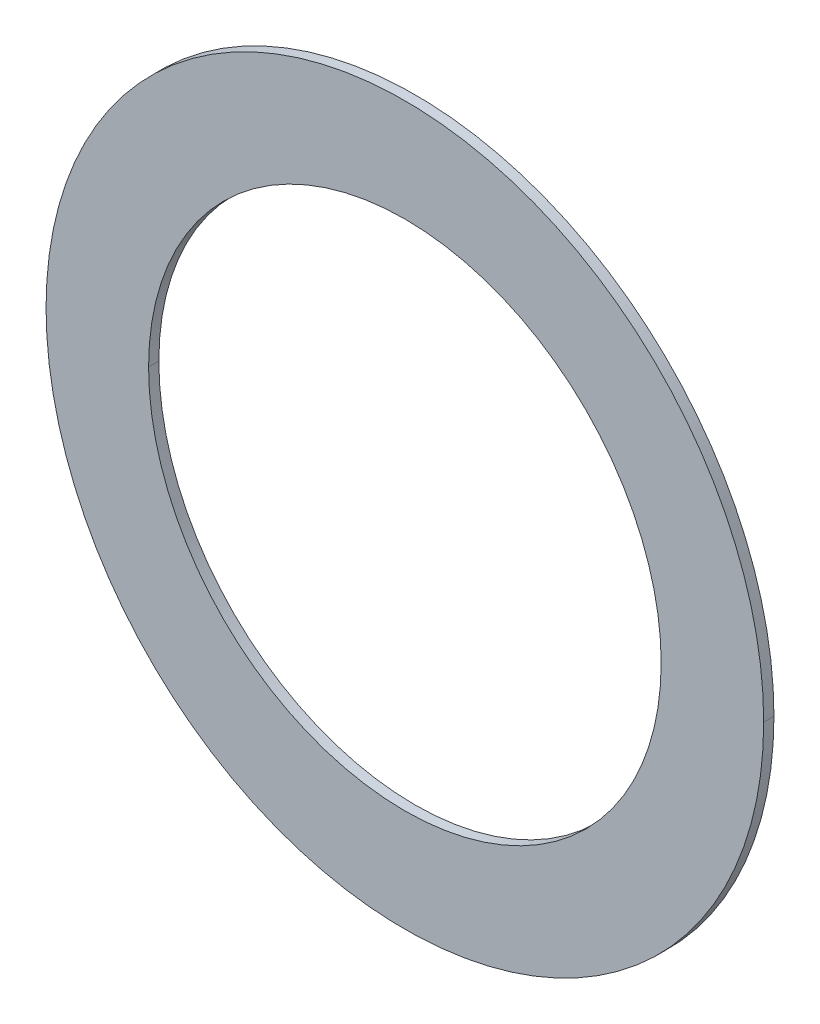
ISO-10303-21;
HEADER;
FILE_DESCRIPTION(('STEP AP214'),'2;1');
FILE_NAME('part.step','',(''),(''),'','','');
FILE_SCHEMA(('AUTOMOTIVE_DESIGN { 1 0 10303 214 1 1 1 1 }'));
ENDSEC;
DATA;
#1=APPLICATION_CONTEXT('core data for automotive mechanical design processes');
#2=APPLICATION_PROTOCOL_DEFINITION('international standard','automotive_design',2000,#1);
#3=PRODUCT_CONTEXT('',#1,'mechanical');
#4=PRODUCT('Part','Part','',(#3));
#5=PRODUCT_RELATED_PRODUCT_CATEGORY('part','',(#4));
#6=PRODUCT_DEFINITION_FORMATION('','',#4);
#7=PRODUCT_DEFINITION_CONTEXT('part definition',#1,'design');
#8=PRODUCT_DEFINITION('design','',#6,#7);
#9=PRODUCT_DEFINITION_SHAPE('','',#8);
#10=(LENGTH_UNIT() NAMED_UNIT(*) SI_UNIT(.MILLI.,.METRE.));
#11=(NAMED_UNIT(*) PLANE_ANGLE_UNIT() SI_UNIT($,.RADIAN.));
#12=(NAMED_UNIT(*) SI_UNIT($,.STERADIAN.) SOLID_ANGLE_UNIT());
#13=UNCERTAINTY_MEASURE_WITH_UNIT(LENGTH_MEASURE(1.E-05),#10,'distance_accuracy_value','');
#14=(GEOMETRIC_REPRESENTATION_CONTEXT(3) GLOBAL_UNCERTAINTY_ASSIGNED_CONTEXT((#13)) GLOBAL_UNIT_ASSIGNED_CONTEXT((#10,
#11,#12)) REPRESENTATION_CONTEXT('',''));
#15=CARTESIAN_POINT('',(0.,0.,0.));
#16=DIRECTION('',(0.,0.,1.));
#17=DIRECTION('',(1.,0.,0.));
#18=AXIS2_PLACEMENT_3D('',#15,#16,#17);
#19=CARTESIAN_POINT('',(0.,7.,0.));
#20=DIRECTION('',(0.,0.,1.));
#21=DIRECTION('',(1.,0.,0.));
#22=AXIS2_PLACEMENT_3D('',#19,#20,#21);
#23=PLANE('',#22);
#24=CARTESIAN_POINT('',(0.,0.,0.));
#25=DIRECTION('',(0.,0.,-1.));
#26=DIRECTION('',(-1.,0.,0.));
#27=AXIS2_PLACEMENT_3D('',#24,#25,#26);
#28=CIRCLE('',#27,5.);
#29=CARTESIAN_POINT('',(-5.,0.,0.));
#30=VERTEX_POINT('',#29);
#31=CARTESIAN_POINT('',(5.,0.,0.));
#32=VERTEX_POINT('',#31);
#33=EDGE_CURVE('E11',#30,#32,#28,.T.);
#34=ORIENTED_EDGE('',*,*,#33,.T.);
#35=CARTESIAN_POINT('',(0.,0.,0.));
#36=DIRECTION('',(0.,0.,-1.));
#37=DIRECTION('',(-1.,0.,0.));
#38=AXIS2_PLACEMENT_3D('',#35,#36,#37);
#39=CIRCLE('',#38,5.);
#40=EDGE_CURVE('E25',#32,#30,#39,.T.);
#41=ORIENTED_EDGE('',*,*,#40,.T.);
#42=EDGE_LOOP('',(#34,#41));
#43=FACE_BOUND('',#42,.T.);
#44=CARTESIAN_POINT('',(0.,0.,0.));
#45=DIRECTION('',(0.,0.,-1.));
#46=DIRECTION('',(-1.,0.,0.));
#47=AXIS2_PLACEMENT_3D('',#44,#45,#46);
#48=CIRCLE('',#47,7.);
#49=CARTESIAN_POINT('',(7.,0.,0.));
#50=VERTEX_POINT('',#49);
#51=CARTESIAN_POINT('',(-7.,0.,0.));
#52=VERTEX_POINT('',#51);
#53=EDGE_CURVE('E95',#50,#52,#48,.T.);
#54=ORIENTED_EDGE('',*,*,#53,.F.);
#55=CARTESIAN_POINT('',(0.,0.,0.));
#56=DIRECTION('',(0.,0.,-1.));
#57=DIRECTION('',(-1.,0.,0.));
#58=AXIS2_PLACEMENT_3D('',#55,#56,#57);
#59=CIRCLE('',#58,7.);
#60=EDGE_CURVE('E90',#52,#50,#59,.T.);
#61=ORIENTED_EDGE('',*,*,#60,.F.);
#62=EDGE_LOOP('',(#54,#61));
#63=FACE_BOUND('',#62,.T.);
#64=ADVANCED_FACE('F17',(#43,#63),#23,.T.);
#65=CARTESIAN_POINT('',(0.,0.,-0.2));
#66=DIRECTION('',(0.,0.,-1.));
#67=DIRECTION('',(0.,-1.,0.));
#68=AXIS2_PLACEMENT_3D('',#65,#66,#67);
#69=CYLINDRICAL_SURFACE('',#68,7.);
#70=DIRECTION('',(0.,0.,-1.));
#71=VECTOR('',#70,1.);
#72=CARTESIAN_POINT('',(7.,0.,0.));
#73=LINE('',#72,#71);
#74=CARTESIAN_POINT('',(7.,0.,-0.2));
#75=VERTEX_POINT('',#74);
#76=EDGE_CURVE('E86',#50,#75,#73,.T.);
#77=ORIENTED_EDGE('',*,*,#76,.T.);
#78=CARTESIAN_POINT('',(0.,0.,-0.2));
#79=DIRECTION('',(0.,0.,-1.));
#80=DIRECTION('',(-1.,0.,0.));
#81=AXIS2_PLACEMENT_3D('',#78,#79,#80);
#82=CIRCLE('',#81,7.);
#83=CARTESIAN_POINT('',(-7.,0.,-0.2));
#84=VERTEX_POINT('',#83);
#85=EDGE_CURVE('E81',#84,#75,#82,.T.);
#86=ORIENTED_EDGE('',*,*,#85,.F.);
#87=DIRECTION('',(0.,0.,-1.));
#88=VECTOR('',#87,1.);
#89=CARTESIAN_POINT('',(-7.,0.,0.));
#90=LINE('',#89,#88);
#91=EDGE_CURVE('E70',#52,#84,#90,.T.);
#92=ORIENTED_EDGE('',*,*,#91,.F.);
#93=ORIENTED_EDGE('',*,*,#60,.T.);
#94=EDGE_LOOP('',(#77,#86,#92,#93));
#95=FACE_BOUND('',#94,.T.);
#96=ADVANCED_FACE('F111',(#95),#69,.T.);
#97=CARTESIAN_POINT('',(0.,0.,-0.2));
#98=DIRECTION('',(0.,0.,-1.));
#99=DIRECTION('',(0.,1.,0.));
#100=AXIS2_PLACEMENT_3D('',#97,#98,#99);
#101=CYLINDRICAL_SURFACE('',#100,7.);
#102=ORIENTED_EDGE('',*,*,#76,.F.);
#103=ORIENTED_EDGE('',*,*,#53,.T.);
#104=ORIENTED_EDGE('',*,*,#91,.T.);
#105=CARTESIAN_POINT('',(0.,0.,-0.2));
#106=DIRECTION('',(0.,0.,-1.));
#107=DIRECTION('',(-1.,0.,0.));
#108=AXIS2_PLACEMENT_3D('',#105,#106,#107);
#109=CIRCLE('',#108,7.);
#110=EDGE_CURVE('E67',#75,#84,#109,.T.);
#111=ORIENTED_EDGE('',*,*,#110,.F.);
#112=EDGE_LOOP('',(#102,#103,#104,#111));
#113=FACE_BOUND('',#112,.T.);
#114=ADVANCED_FACE('F106',(#113),#101,.T.);
#115=CARTESIAN_POINT('',(0.,5.,-0.2));
#116=DIRECTION('',(0.,0.,-1.));
#117=DIRECTION('',(-1.,0.,0.));
#118=AXIS2_PLACEMENT_3D('',#115,#116,#117);
#119=PLANE('',#118);
#120=ORIENTED_EDGE('',*,*,#85,.T.);
#121=ORIENTED_EDGE('',*,*,#110,.T.);
#122=EDGE_LOOP('',(#120,#121));
#123=FACE_BOUND('',#122,.T.);
#124=CARTESIAN_POINT('',(0.,0.,-0.2));
#125=DIRECTION('',(0.,0.,-1.));
#126=DIRECTION('',(-1.,0.,0.));
#127=AXIS2_PLACEMENT_3D('',#124,#125,#126);
#128=CIRCLE('',#127,5.);
#129=CARTESIAN_POINT('',(5.,0.,-0.2));
#130=VERTEX_POINT('',#129);
#131=CARTESIAN_POINT('',(-5.,0.,-0.2));
#132=VERTEX_POINT('',#131);
#133=EDGE_CURVE('E55',#130,#132,#128,.T.);
#134=ORIENTED_EDGE('',*,*,#133,.F.);
#135=CARTESIAN_POINT('',(0.,0.,-0.2));
#136=DIRECTION('',(0.,0.,-1.));
#137=DIRECTION('',(-1.,0.,0.));
#138=AXIS2_PLACEMENT_3D('',#135,#136,#137);
#139=CIRCLE('',#138,5.);
#140=EDGE_CURVE('E51',#132,#130,#139,.T.);
#141=ORIENTED_EDGE('',*,*,#140,.F.);
#142=EDGE_LOOP('',(#134,#141));
#143=FACE_BOUND('',#142,.T.);
#144=ADVANCED_FACE('F53',(#123,#143),#119,.T.);
#145=CARTESIAN_POINT('',(0.,0.,-0.2));
#146=DIRECTION('',(0.,0.,-1.));
#147=DIRECTION('',(0.,-1.,0.));
#148=AXIS2_PLACEMENT_3D('',#145,#146,#147);
#149=CYLINDRICAL_SURFACE('',#148,5.);
#150=DIRECTION('',(0.,0.,-1.));
#151=VECTOR('',#150,1.);
#152=CARTESIAN_POINT('',(5.,0.,0.));
#153=LINE('',#152,#151);
#154=EDGE_CURVE('E59',#32,#130,#153,.T.);
#155=ORIENTED_EDGE('',*,*,#154,.F.);
#156=ORIENTED_EDGE('',*,*,#33,.F.);
#157=DIRECTION('',(0.,0.,-1.));
#158=VECTOR('',#157,1.);
#159=CARTESIAN_POINT('',(-5.,0.,0.));
#160=LINE('',#159,#158);
#161=EDGE_CURVE('E62',#30,#132,#160,.T.);
#162=ORIENTED_EDGE('',*,*,#161,.T.);
#163=ORIENTED_EDGE('',*,*,#140,.T.);
#164=EDGE_LOOP('',(#155,#156,#162,#163));
#165=FACE_BOUND('',#164,.T.);
#166=ADVANCED_FACE('F63',(#165),#149,.F.);
#167=CARTESIAN_POINT('',(0.,0.,-0.2));
#168=DIRECTION('',(0.,0.,-1.));
#169=DIRECTION('',(0.,1.,0.));
#170=AXIS2_PLACEMENT_3D('',#167,#168,#169);
#171=CYLINDRICAL_SURFACE('',#170,5.);
#172=ORIENTED_EDGE('',*,*,#154,.T.);
#173=ORIENTED_EDGE('',*,*,#133,.T.);
#174=ORIENTED_EDGE('',*,*,#161,.F.);
#175=ORIENTED_EDGE('',*,*,#40,.F.);
#176=EDGE_LOOP('',(#172,#173,#174,#175));
#177=FACE_BOUND('',#176,.T.);
#178=ADVANCED_FACE('F66',(#177),#171,.F.);
#179=CLOSED_SHELL('',(#64,#96,#114,#144,#166,#178));
#180=MANIFOLD_SOLID_BREP('B1',#179);
#181=ADVANCED_BREP_SHAPE_REPRESENTATION('',(#18,#180),#14);
#182=SHAPE_DEFINITION_REPRESENTATION(#9,#181);
ENDSEC;
END-ISO-10303-21;
